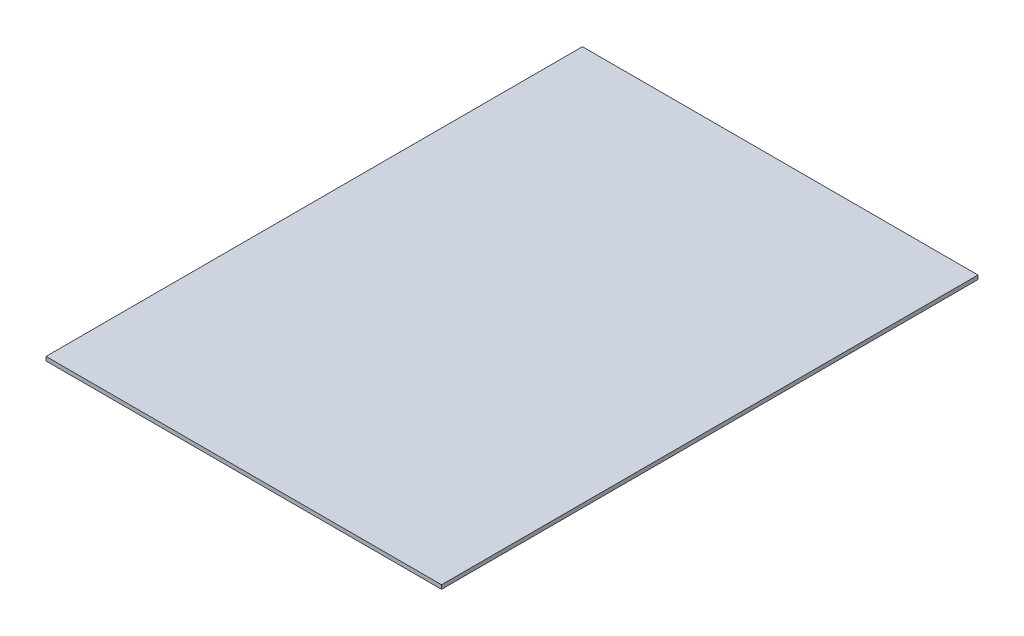
ISO-10303-21;
HEADER;
FILE_DESCRIPTION(('STEP AP214'),'2;1');
FILE_NAME('part.step','',(''),(''),'','','');
FILE_SCHEMA(('AUTOMOTIVE_DESIGN { 1 0 10303 214 1 1 1 1 }'));
ENDSEC;
DATA;
#1=APPLICATION_CONTEXT('core data for automotive mechanical design processes');
#2=APPLICATION_PROTOCOL_DEFINITION('international standard','automotive_design',2000,#1);
#3=PRODUCT_CONTEXT('',#1,'mechanical');
#4=PRODUCT('Part','Part','',(#3));
#5=PRODUCT_RELATED_PRODUCT_CATEGORY('part','',(#4));
#6=PRODUCT_DEFINITION_FORMATION('','',#4);
#7=PRODUCT_DEFINITION_CONTEXT('part definition',#1,'design');
#8=PRODUCT_DEFINITION('design','',#6,#7);
#9=PRODUCT_DEFINITION_SHAPE('','',#8);
#10=(LENGTH_UNIT() NAMED_UNIT(*) SI_UNIT(.MILLI.,.METRE.));
#11=(NAMED_UNIT(*) PLANE_ANGLE_UNIT() SI_UNIT($,.RADIAN.));
#12=(NAMED_UNIT(*) SI_UNIT($,.STERADIAN.) SOLID_ANGLE_UNIT());
#13=UNCERTAINTY_MEASURE_WITH_UNIT(LENGTH_MEASURE(1.E-05),#10,'distance_accuracy_value','');
#14=(GEOMETRIC_REPRESENTATION_CONTEXT(3) GLOBAL_UNCERTAINTY_ASSIGNED_CONTEXT((#13)) GLOBAL_UNIT_ASSIGNED_CONTEXT((#10,
#11,#12)) REPRESENTATION_CONTEXT('',''));
#15=CARTESIAN_POINT('',(0.,0.,0.));
#16=DIRECTION('',(0.,0.,1.));
#17=DIRECTION('',(1.,0.,0.));
#18=AXIS2_PLACEMENT_3D('',#15,#16,#17);
#19=CARTESIAN_POINT('',(150.,3.,-203.45));
#20=DIRECTION('',(-1.,0.,0.));
#21=DIRECTION('',(0.,0.,1.));
#22=AXIS2_PLACEMENT_3D('',#19,#20,#21);
#23=PLANE('',#22);
#24=DIRECTION('',(0.,0.,-1.));
#25=VECTOR('',#24,1.);
#26=CARTESIAN_POINT('',(150.,0.,-203.45));
#27=LINE('',#26,#25);
#28=CARTESIAN_POINT('',(150.,0.,203.45));
#29=VERTEX_POINT('',#28);
#30=CARTESIAN_POINT('',(150.,0.,-203.45));
#31=VERTEX_POINT('',#30);
#32=EDGE_CURVE('E104',#29,#31,#27,.T.);
#33=ORIENTED_EDGE('',*,*,#32,.T.);
#34=DIRECTION('',(0.,-1.,0.));
#35=VECTOR('',#34,1.);
#36=CARTESIAN_POINT('',(150.,3.,-203.45));
#37=LINE('',#36,#35);
#38=CARTESIAN_POINT('',(150.,3.,-203.45));
#39=VERTEX_POINT('',#38);
#40=EDGE_CURVE('E11',#39,#31,#37,.T.);
#41=ORIENTED_EDGE('',*,*,#40,.F.);
#42=DIRECTION('',(0.,0.,-1.));
#43=VECTOR('',#42,1.);
#44=CARTESIAN_POINT('',(150.,3.,-203.45));
#45=LINE('',#44,#43);
#46=CARTESIAN_POINT('',(150.,3.,203.45));
#47=VERTEX_POINT('',#46);
#48=EDGE_CURVE('E92',#47,#39,#45,.T.);
#49=ORIENTED_EDGE('',*,*,#48,.F.);
#50=DIRECTION('',(0.,-1.,0.));
#51=VECTOR('',#50,1.);
#52=CARTESIAN_POINT('',(150.,3.,203.45));
#53=LINE('',#52,#51);
#54=EDGE_CURVE('E100',#47,#29,#53,.T.);
#55=ORIENTED_EDGE('',*,*,#54,.T.);
#56=EDGE_LOOP('',(#33,#41,#49,#55));
#57=FACE_BOUND('',#56,.T.);
#58=ADVANCED_FACE('F41',(#57),#23,.F.);
#59=CARTESIAN_POINT('',(-150.,3.,-203.45));
#60=DIRECTION('',(0.,0.,1.));
#61=DIRECTION('',(1.,0.,0.));
#62=AXIS2_PLACEMENT_3D('',#59,#60,#61);
#63=PLANE('',#62);
#64=DIRECTION('',(-1.,0.,0.));
#65=VECTOR('',#64,1.);
#66=CARTESIAN_POINT('',(-150.,0.,-203.45));
#67=LINE('',#66,#65);
#68=CARTESIAN_POINT('',(-150.,0.,-203.45));
#69=VERTEX_POINT('',#68);
#70=EDGE_CURVE('E96',#31,#69,#67,.T.);
#71=ORIENTED_EDGE('',*,*,#70,.T.);
#72=DIRECTION('',(0.,-1.,0.));
#73=VECTOR('',#72,1.);
#74=CARTESIAN_POINT('',(-150.,3.,-203.45));
#75=LINE('',#74,#73);
#76=CARTESIAN_POINT('',(-150.,3.,-203.45));
#77=VERTEX_POINT('',#76);
#78=EDGE_CURVE('E49',#77,#69,#75,.T.);
#79=ORIENTED_EDGE('',*,*,#78,.F.);
#80=DIRECTION('',(-1.,0.,0.));
#81=VECTOR('',#80,1.);
#82=CARTESIAN_POINT('',(-150.,3.,-203.45));
#83=LINE('',#82,#81);
#84=EDGE_CURVE('E87',#39,#77,#83,.T.);
#85=ORIENTED_EDGE('',*,*,#84,.F.);
#86=ORIENTED_EDGE('',*,*,#40,.T.);
#87=EDGE_LOOP('',(#71,#79,#85,#86));
#88=FACE_BOUND('',#87,.T.);
#89=ADVANCED_FACE('F95',(#88),#63,.F.);
#90=CARTESIAN_POINT('',(-150.,3.,-203.45));
#91=DIRECTION('',(1.,0.,0.));
#92=DIRECTION('',(0.,0.,-1.));
#93=AXIS2_PLACEMENT_3D('',#90,#91,#92);
#94=PLANE('',#93);
#95=DIRECTION('',(0.,0.,1.));
#96=VECTOR('',#95,1.);
#97=CARTESIAN_POINT('',(-150.,0.,-203.45));
#98=LINE('',#97,#96);
#99=CARTESIAN_POINT('',(-150.,0.,203.45));
#100=VERTEX_POINT('',#99);
#101=EDGE_CURVE('E74',#69,#100,#98,.T.);
#102=ORIENTED_EDGE('',*,*,#101,.T.);
#103=DIRECTION('',(0.,-1.,0.));
#104=VECTOR('',#103,1.);
#105=CARTESIAN_POINT('',(-150.,3.,203.45));
#106=LINE('',#105,#104);
#107=CARTESIAN_POINT('',(-150.,3.,203.45));
#108=VERTEX_POINT('',#107);
#109=EDGE_CURVE('E97',#108,#100,#106,.T.);
#110=ORIENTED_EDGE('',*,*,#109,.F.);
#111=DIRECTION('',(0.,0.,1.));
#112=VECTOR('',#111,1.);
#113=CARTESIAN_POINT('',(-150.,3.,-203.45));
#114=LINE('',#113,#112);
#115=EDGE_CURVE('E90',#77,#108,#114,.T.);
#116=ORIENTED_EDGE('',*,*,#115,.F.);
#117=ORIENTED_EDGE('',*,*,#78,.T.);
#118=EDGE_LOOP('',(#102,#110,#116,#117));
#119=FACE_BOUND('',#118,.T.);
#120=ADVANCED_FACE('F98',(#119),#94,.F.);
#121=CARTESIAN_POINT('',(-150.,3.,203.45));
#122=DIRECTION('',(0.,0.,-1.));
#123=DIRECTION('',(-1.,0.,0.));
#124=AXIS2_PLACEMENT_3D('',#121,#122,#123);
#125=PLANE('',#124);
#126=DIRECTION('',(1.,0.,0.));
#127=VECTOR('',#126,1.);
#128=CARTESIAN_POINT('',(-150.,0.,203.45));
#129=LINE('',#128,#127);
#130=EDGE_CURVE('E80',#100,#29,#129,.T.);
#131=ORIENTED_EDGE('',*,*,#130,.T.);
#132=ORIENTED_EDGE('',*,*,#54,.F.);
#133=DIRECTION('',(1.,0.,0.));
#134=VECTOR('',#133,1.);
#135=CARTESIAN_POINT('',(-150.,3.,203.45));
#136=LINE('',#135,#134);
#137=EDGE_CURVE('E57',#108,#47,#136,.T.);
#138=ORIENTED_EDGE('',*,*,#137,.F.);
#139=ORIENTED_EDGE('',*,*,#109,.T.);
#140=EDGE_LOOP('',(#131,#132,#138,#139));
#141=FACE_BOUND('',#140,.T.);
#142=ADVANCED_FACE('F111',(#141),#125,.F.);
#143=CARTESIAN_POINT('',(0.,3.,0.));
#144=DIRECTION('',(0.,1.,0.));
#145=DIRECTION('',(0.,0.,1.));
#146=AXIS2_PLACEMENT_3D('',#143,#144,#145);
#147=PLANE('',#146);
#148=ORIENTED_EDGE('',*,*,#48,.T.);
#149=ORIENTED_EDGE('',*,*,#84,.T.);
#150=ORIENTED_EDGE('',*,*,#115,.T.);
#151=ORIENTED_EDGE('',*,*,#137,.T.);
#152=EDGE_LOOP('',(#148,#149,#150,#151));
#153=FACE_BOUND('',#152,.T.);
#154=ADVANCED_FACE('F88',(#153),#147,.T.);
#155=CARTESIAN_POINT('',(0.,0.,0.));
#156=DIRECTION('',(0.,1.,0.));
#157=DIRECTION('',(0.,0.,1.));
#158=AXIS2_PLACEMENT_3D('',#155,#156,#157);
#159=PLANE('',#158);
#160=ORIENTED_EDGE('',*,*,#32,.F.);
#161=ORIENTED_EDGE('',*,*,#130,.F.);
#162=ORIENTED_EDGE('',*,*,#101,.F.);
#163=ORIENTED_EDGE('',*,*,#70,.F.);
#164=EDGE_LOOP('',(#160,#161,#162,#163));
#165=FACE_BOUND('',#164,.T.);
#166=ADVANCED_FACE('F114',(#165),#159,.F.);
#167=CLOSED_SHELL('',(#58,#89,#120,#142,#154,#166));
#168=MANIFOLD_SOLID_BREP('B2',#167);
#169=ADVANCED_BREP_SHAPE_REPRESENTATION('',(#18,#168),#14);
#170=SHAPE_DEFINITION_REPRESENTATION(#9,#169);
ENDSEC;
END-ISO-10303-21;
